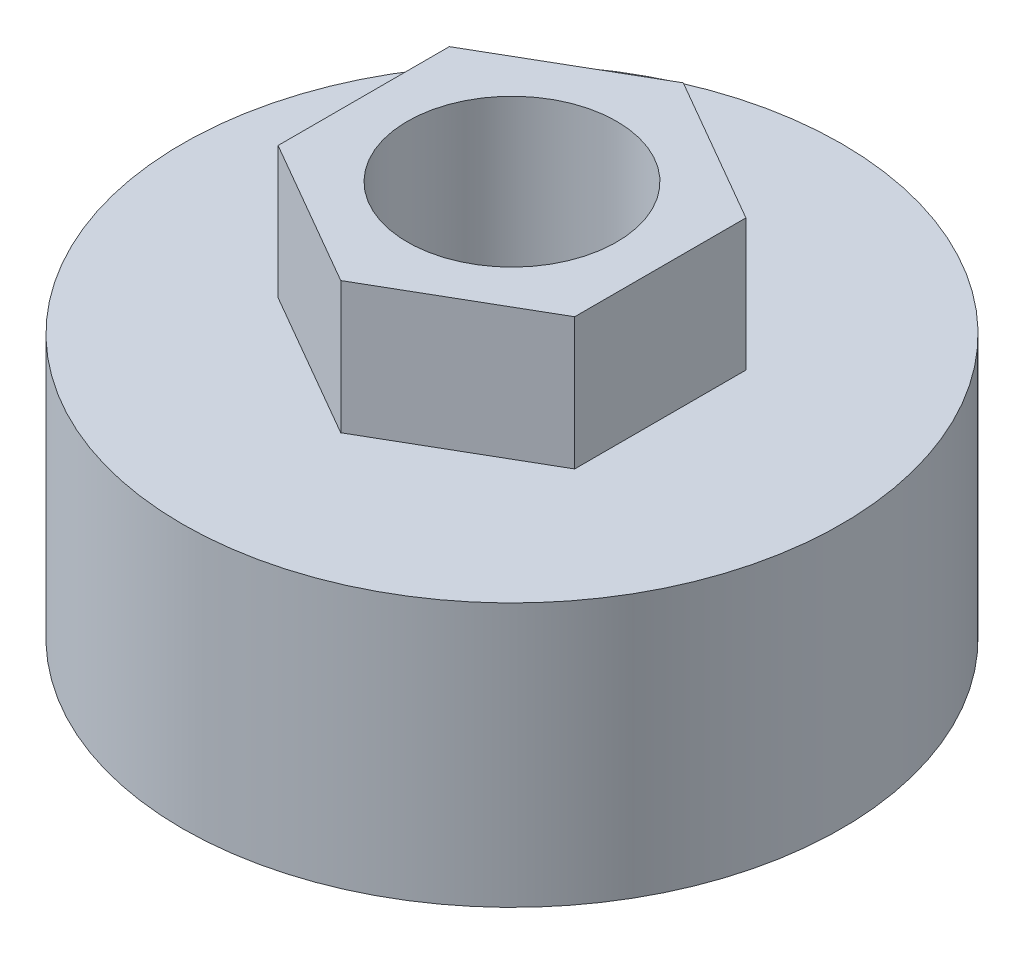
ISO-10303-21;
HEADER;
FILE_DESCRIPTION(('STEP AP214'),'2;1');
FILE_NAME('part.step','',(''),(''),'','','');
FILE_SCHEMA(('AUTOMOTIVE_DESIGN { 1 0 10303 214 1 1 1 1 }'));
ENDSEC;
DATA;
#1=APPLICATION_CONTEXT('core data for automotive mechanical design processes');
#2=APPLICATION_PROTOCOL_DEFINITION('international standard','automotive_design',2000,#1);
#3=PRODUCT_CONTEXT('',#1,'mechanical');
#4=PRODUCT('Part','Part','',(#3));
#5=PRODUCT_RELATED_PRODUCT_CATEGORY('part','',(#4));
#6=PRODUCT_DEFINITION_FORMATION('','',#4);
#7=PRODUCT_DEFINITION_CONTEXT('part definition',#1,'design');
#8=PRODUCT_DEFINITION('design','',#6,#7);
#9=PRODUCT_DEFINITION_SHAPE('','',#8);
#10=(LENGTH_UNIT() NAMED_UNIT(*) SI_UNIT(.MILLI.,.METRE.));
#11=(NAMED_UNIT(*) PLANE_ANGLE_UNIT() SI_UNIT($,.RADIAN.));
#12=(NAMED_UNIT(*) SI_UNIT($,.STERADIAN.) SOLID_ANGLE_UNIT());
#13=UNCERTAINTY_MEASURE_WITH_UNIT(LENGTH_MEASURE(1.E-05),#10,'distance_accuracy_value','');
#14=(GEOMETRIC_REPRESENTATION_CONTEXT(3) GLOBAL_UNCERTAINTY_ASSIGNED_CONTEXT((#13)) GLOBAL_UNIT_ASSIGNED_CONTEXT((#10,
#11,#12)) REPRESENTATION_CONTEXT('',''));
#15=CARTESIAN_POINT('',(0.,0.,0.));
#16=DIRECTION('',(0.,0.,1.));
#17=DIRECTION('',(1.,0.,0.));
#18=AXIS2_PLACEMENT_3D('',#15,#16,#17);
#19=CARTESIAN_POINT('',(5.0419,12.7,0.));
#20=DIRECTION('',(0.,1.,0.));
#21=DIRECTION('',(0.,0.,1.));
#22=AXIS2_PLACEMENT_3D('',#19,#20,#21);
#23=PLANE('',#22);
#24=CARTESIAN_POINT('',(0.,12.7,0.));
#25=DIRECTION('',(0.,-1.,0.));
#26=DIRECTION('',(0.,0.,-1.));
#27=AXIS2_PLACEMENT_3D('',#24,#25,#26);
#28=CIRCLE('',#27,15.875);
#29=CARTESIAN_POINT('',(0.,12.7,-15.875));
#30=VERTEX_POINT('',#29);
#31=EDGE_CURVE('E44',#30,#30,#28,.T.);
#32=ORIENTED_EDGE('',*,*,#31,.F.);
#33=EDGE_LOOP('',(#32));
#34=FACE_BOUND('',#33,.T.);
#35=DIRECTION('',(-0.866025403784439,0.,0.5));
#36=VECTOR('',#35,1.);
#37=CARTESIAN_POINT('',(0.,12.7,-8.24889197104678));
#38=LINE('',#37,#36);
#39=CARTESIAN_POINT('',(0.,12.7,-8.24889197104678));
#40=VERTEX_POINT('',#39);
#41=CARTESIAN_POINT('',(-7.14375,12.7,-4.12444598552339));
#42=VERTEX_POINT('',#41);
#43=EDGE_CURVE('E293',#40,#42,#38,.T.);
#44=ORIENTED_EDGE('',*,*,#43,.F.);
#45=DIRECTION('',(-0.866025403784439,0.,-0.5));
#46=VECTOR('',#45,1.);
#47=CARTESIAN_POINT('',(7.14375,12.7,-4.12444598552339));
#48=LINE('',#47,#46);
#49=CARTESIAN_POINT('',(7.14375,12.7,-4.12444598552339));
#50=VERTEX_POINT('',#49);
#51=EDGE_CURVE('E148',#50,#40,#48,.T.);
#52=ORIENTED_EDGE('',*,*,#51,.F.);
#53=DIRECTION('',(0.,0.,-1.));
#54=VECTOR('',#53,1.);
#55=CARTESIAN_POINT('',(7.14375,12.7,4.12444598552339));
#56=LINE('',#55,#54);
#57=CARTESIAN_POINT('',(7.14375,12.7,4.12444598552339));
#58=VERTEX_POINT('',#57);
#59=EDGE_CURVE('E144',#58,#50,#56,.T.);
#60=ORIENTED_EDGE('',*,*,#59,.F.);
#61=DIRECTION('',(0.866025403784439,0.,-0.5));
#62=VECTOR('',#61,1.);
#63=CARTESIAN_POINT('',(0.,12.7,8.24889197104678));
#64=LINE('',#63,#62);
#65=CARTESIAN_POINT('',(0.,12.7,8.24889197104678));
#66=VERTEX_POINT('',#65);
#67=EDGE_CURVE('E308',#66,#58,#64,.T.);
#68=ORIENTED_EDGE('',*,*,#67,.F.);
#69=DIRECTION('',(0.866025403784439,0.,0.5));
#70=VECTOR('',#69,1.);
#71=CARTESIAN_POINT('',(-7.14375,12.7,4.12444598552339));
#72=LINE('',#71,#70);
#73=CARTESIAN_POINT('',(-7.14375,12.7,4.12444598552339));
#74=VERTEX_POINT('',#73);
#75=EDGE_CURVE('E306',#74,#66,#72,.T.);
#76=ORIENTED_EDGE('',*,*,#75,.F.);
#77=DIRECTION('',(0.,0.,1.));
#78=VECTOR('',#77,1.);
#79=CARTESIAN_POINT('',(-7.14375,12.7,-4.12444598552339));
#80=LINE('',#79,#78);
#81=EDGE_CURVE('E304',#42,#74,#80,.T.);
#82=ORIENTED_EDGE('',*,*,#81,.F.);
#83=EDGE_LOOP('',(#44,#52,#60,#68,#76,#82));
#84=FACE_BOUND('',#83,.T.);
#85=ADVANCED_FACE('F35',(#34,#84),#23,.T.);
#86=CARTESIAN_POINT('',(0.,0.,0.));
#87=DIRECTION('',(0.,-1.,0.));
#88=DIRECTION('',(0.,0.,-1.));
#89=AXIS2_PLACEMENT_3D('',#86,#87,#88);
#90=CYLINDRICAL_SURFACE('',#89,5.0419);
#91=CARTESIAN_POINT('',(0.,9.525,0.));
#92=DIRECTION('',(0.,-1.,0.));
#93=DIRECTION('',(0.,0.,-1.));
#94=AXIS2_PLACEMENT_3D('',#91,#92,#93);
#95=CIRCLE('',#94,5.0419);
#96=CARTESIAN_POINT('',(0.,9.525,-5.0419));
#97=VERTEX_POINT('',#96);
#98=EDGE_CURVE('E39',#97,#97,#95,.T.);
#99=ORIENTED_EDGE('',*,*,#98,.T.);
#100=EDGE_LOOP('',(#99));
#101=FACE_BOUND('',#100,.T.);
#102=CARTESIAN_POINT('',(0.,19.05,0.));
#103=DIRECTION('',(0.,-1.,0.));
#104=DIRECTION('',(0.,0.,-1.));
#105=AXIS2_PLACEMENT_3D('',#102,#103,#104);
#106=CIRCLE('',#105,5.0419);
#107=CARTESIAN_POINT('',(0.,19.05,-5.0419));
#108=VERTEX_POINT('',#107);
#109=EDGE_CURVE('E291',#108,#108,#106,.T.);
#110=ORIENTED_EDGE('',*,*,#109,.F.);
#111=EDGE_LOOP('',(#110));
#112=FACE_BOUND('',#111,.T.);
#113=ADVANCED_FACE('F207',(#101,#112),#90,.F.);
#114=CARTESIAN_POINT('',(5.0419,0.,0.));
#115=DIRECTION('',(0.,-1.,0.));
#116=DIRECTION('',(0.,0.,-1.));
#117=AXIS2_PLACEMENT_3D('',#114,#115,#116);
#118=PLANE('',#117);
#119=DIRECTION('',(0.866025403784439,0.,0.5));
#120=VECTOR('',#119,1.);
#121=CARTESIAN_POINT('',(0.,0.,-8.79881810244989));
#122=LINE('',#121,#120);
#123=CARTESIAN_POINT('',(0.,0.,-8.79881810244989));
#124=VERTEX_POINT('',#123);
#125=CARTESIAN_POINT('',(7.62,0.,-4.39940905122495));
#126=VERTEX_POINT('',#125);
#127=EDGE_CURVE('E59',#124,#126,#122,.T.);
#128=ORIENTED_EDGE('',*,*,#127,.F.);
#129=DIRECTION('',(0.866025403784439,0.,-0.5));
#130=VECTOR('',#129,1.);
#131=CARTESIAN_POINT('',(-7.62,0.,-4.39940905122495));
#132=LINE('',#131,#130);
#133=CARTESIAN_POINT('',(-7.62,0.,-4.39940905122495));
#134=VERTEX_POINT('',#133);
#135=EDGE_CURVE('E161',#134,#124,#132,.T.);
#136=ORIENTED_EDGE('',*,*,#135,.F.);
#137=DIRECTION('',(0.,0.,-1.));
#138=VECTOR('',#137,1.);
#139=CARTESIAN_POINT('',(-7.62,0.,4.39940905122495));
#140=LINE('',#139,#138);
#141=CARTESIAN_POINT('',(-7.62,0.,4.39940905122495));
#142=VERTEX_POINT('',#141);
#143=EDGE_CURVE('E185',#142,#134,#140,.T.);
#144=ORIENTED_EDGE('',*,*,#143,.F.);
#145=DIRECTION('',(-0.866025403784439,0.,-0.5));
#146=VECTOR('',#145,1.);
#147=CARTESIAN_POINT('',(0.,0.,8.79881810244989));
#148=LINE('',#147,#146);
#149=CARTESIAN_POINT('',(0.,0.,8.79881810244989));
#150=VERTEX_POINT('',#149);
#151=EDGE_CURVE('E182',#150,#142,#148,.T.);
#152=ORIENTED_EDGE('',*,*,#151,.F.);
#153=DIRECTION('',(-0.866025403784439,0.,0.5));
#154=VECTOR('',#153,1.);
#155=CARTESIAN_POINT('',(7.62,0.,4.39940905122495));
#156=LINE('',#155,#154);
#157=CARTESIAN_POINT('',(7.62,0.,4.39940905122495));
#158=VERTEX_POINT('',#157);
#159=EDGE_CURVE('E179',#158,#150,#156,.T.);
#160=ORIENTED_EDGE('',*,*,#159,.F.);
#161=DIRECTION('',(0.,0.,1.));
#162=VECTOR('',#161,1.);
#163=CARTESIAN_POINT('',(7.62,0.,-4.39940905122495));
#164=LINE('',#163,#162);
#165=EDGE_CURVE('E151',#126,#158,#164,.T.);
#166=ORIENTED_EDGE('',*,*,#165,.F.);
#167=EDGE_LOOP('',(#128,#136,#144,#152,#160,#166));
#168=FACE_BOUND('',#167,.T.);
#169=CARTESIAN_POINT('',(0.,0.,0.));
#170=DIRECTION('',(0.,-1.,0.));
#171=DIRECTION('',(0.,0.,-1.));
#172=AXIS2_PLACEMENT_3D('',#169,#170,#171);
#173=CIRCLE('',#172,15.875);
#174=CARTESIAN_POINT('',(0.,0.,-15.875));
#175=VERTEX_POINT('',#174);
#176=EDGE_CURVE('E11',#175,#175,#173,.T.);
#177=ORIENTED_EDGE('',*,*,#176,.T.);
#178=EDGE_LOOP('',(#177));
#179=FACE_BOUND('',#178,.T.);
#180=ADVANCED_FACE('F37',(#168,#179),#118,.T.);
#181=CARTESIAN_POINT('',(0.,0.,0.));
#182=DIRECTION('',(0.,-1.,0.));
#183=DIRECTION('',(0.,0.,-1.));
#184=AXIS2_PLACEMENT_3D('',#181,#182,#183);
#185=CYLINDRICAL_SURFACE('',#184,15.875);
#186=ORIENTED_EDGE('',*,*,#31,.T.);
#187=EDGE_LOOP('',(#186));
#188=FACE_BOUND('',#187,.T.);
#189=ORIENTED_EDGE('',*,*,#176,.F.);
#190=EDGE_LOOP('',(#189));
#191=FACE_BOUND('',#190,.T.);
#192=ADVANCED_FACE('F239',(#188,#191),#185,.T.);
#193=CARTESIAN_POINT('',(0.,9.525,-8.79881810244989));
#194=DIRECTION('',(0.5,0.,-0.866025403784439));
#195=DIRECTION('',(-0.866025403784439,0.,-0.5));
#196=AXIS2_PLACEMENT_3D('',#193,#194,#195);
#197=PLANE('',#196);
#198=ORIENTED_EDGE('',*,*,#127,.T.);
#199=DIRECTION('',(0.,-1.,0.));
#200=VECTOR('',#199,1.);
#201=CARTESIAN_POINT('',(7.62,9.525,-4.39940905122495));
#202=LINE('',#201,#200);
#203=CARTESIAN_POINT('',(7.62,9.525,-4.39940905122495));
#204=VERTEX_POINT('',#203);
#205=EDGE_CURVE('E175',#204,#126,#202,.T.);
#206=ORIENTED_EDGE('',*,*,#205,.F.);
#207=DIRECTION('',(0.866025403784439,0.,0.5));
#208=VECTOR('',#207,1.);
#209=CARTESIAN_POINT('',(0.,9.525,-8.79881810244989));
#210=LINE('',#209,#208);
#211=CARTESIAN_POINT('',(0.,9.525,-8.79881810244989));
#212=VERTEX_POINT('',#211);
#213=EDGE_CURVE('E157',#212,#204,#210,.T.);
#214=ORIENTED_EDGE('',*,*,#213,.F.);
#215=DIRECTION('',(0.,-1.,0.));
#216=VECTOR('',#215,1.);
#217=CARTESIAN_POINT('',(0.,9.525,-8.79881810244989));
#218=LINE('',#217,#216);
#219=EDGE_CURVE('E190',#212,#124,#218,.T.);
#220=ORIENTED_EDGE('',*,*,#219,.T.);
#221=EDGE_LOOP('',(#198,#206,#214,#220));
#222=FACE_BOUND('',#221,.T.);
#223=ADVANCED_FACE('F218',(#222),#197,.F.);
#224=CARTESIAN_POINT('',(-7.62,9.525,-4.39940905122495));
#225=DIRECTION('',(-0.5,0.,-0.866025403784439));
#226=DIRECTION('',(-0.866025403784438,0.,0.5));
#227=AXIS2_PLACEMENT_3D('',#224,#225,#226);
#228=PLANE('',#227);
#229=ORIENTED_EDGE('',*,*,#135,.T.);
#230=ORIENTED_EDGE('',*,*,#219,.F.);
#231=DIRECTION('',(0.866025403784439,0.,-0.5));
#232=VECTOR('',#231,1.);
#233=CARTESIAN_POINT('',(-7.62,9.525,-4.39940905122495));
#234=LINE('',#233,#232);
#235=CARTESIAN_POINT('',(-7.62,9.525,-4.39940905122495));
#236=VERTEX_POINT('',#235);
#237=EDGE_CURVE('E173',#236,#212,#234,.T.);
#238=ORIENTED_EDGE('',*,*,#237,.F.);
#239=DIRECTION('',(0.,-1.,0.));
#240=VECTOR('',#239,1.);
#241=CARTESIAN_POINT('',(-7.62,9.525,-4.39940905122495));
#242=LINE('',#241,#240);
#243=EDGE_CURVE('E192',#236,#134,#242,.T.);
#244=ORIENTED_EDGE('',*,*,#243,.T.);
#245=EDGE_LOOP('',(#229,#230,#238,#244));
#246=FACE_BOUND('',#245,.T.);
#247=ADVANCED_FACE('F235',(#246),#228,.F.);
#248=CARTESIAN_POINT('',(-7.62,9.525,4.39940905122495));
#249=DIRECTION('',(-1.,0.,0.));
#250=DIRECTION('',(0.,0.,1.));
#251=AXIS2_PLACEMENT_3D('',#248,#249,#250);
#252=PLANE('',#251);
#253=ORIENTED_EDGE('',*,*,#143,.T.);
#254=ORIENTED_EDGE('',*,*,#243,.F.);
#255=DIRECTION('',(0.,0.,-1.));
#256=VECTOR('',#255,1.);
#257=CARTESIAN_POINT('',(-7.62,9.525,4.39940905122495));
#258=LINE('',#257,#256);
#259=CARTESIAN_POINT('',(-7.62,9.525,4.39940905122495));
#260=VERTEX_POINT('',#259);
#261=EDGE_CURVE('E170',#260,#236,#258,.T.);
#262=ORIENTED_EDGE('',*,*,#261,.F.);
#263=DIRECTION('',(0.,-1.,0.));
#264=VECTOR('',#263,1.);
#265=CARTESIAN_POINT('',(-7.62,9.525,4.39940905122495));
#266=LINE('',#265,#264);
#267=EDGE_CURVE('E194',#260,#142,#266,.T.);
#268=ORIENTED_EDGE('',*,*,#267,.T.);
#269=EDGE_LOOP('',(#253,#254,#262,#268));
#270=FACE_BOUND('',#269,.T.);
#271=ADVANCED_FACE('F232',(#270),#252,.F.);
#272=CARTESIAN_POINT('',(0.,9.525,8.79881810244989));
#273=DIRECTION('',(-0.5,0.,0.866025403784439));
#274=DIRECTION('',(0.866025403784439,0.,0.5));
#275=AXIS2_PLACEMENT_3D('',#272,#273,#274);
#276=PLANE('',#275);
#277=ORIENTED_EDGE('',*,*,#151,.T.);
#278=ORIENTED_EDGE('',*,*,#267,.F.);
#279=DIRECTION('',(-0.866025403784439,0.,-0.5));
#280=VECTOR('',#279,1.);
#281=CARTESIAN_POINT('',(0.,9.525,8.79881810244989));
#282=LINE('',#281,#280);
#283=CARTESIAN_POINT('',(0.,9.525,8.79881810244989));
#284=VERTEX_POINT('',#283);
#285=EDGE_CURVE('E167',#284,#260,#282,.T.);
#286=ORIENTED_EDGE('',*,*,#285,.F.);
#287=DIRECTION('',(0.,-1.,0.));
#288=VECTOR('',#287,1.);
#289=CARTESIAN_POINT('',(0.,9.525,8.79881810244989));
#290=LINE('',#289,#288);
#291=EDGE_CURVE('E196',#284,#150,#290,.T.);
#292=ORIENTED_EDGE('',*,*,#291,.T.);
#293=EDGE_LOOP('',(#277,#278,#286,#292));
#294=FACE_BOUND('',#293,.T.);
#295=ADVANCED_FACE('F228',(#294),#276,.F.);
#296=CARTESIAN_POINT('',(7.62,9.525,4.39940905122495));
#297=DIRECTION('',(0.5,0.,0.866025403784439));
#298=DIRECTION('',(0.866025403784439,0.,-0.5));
#299=AXIS2_PLACEMENT_3D('',#296,#297,#298);
#300=PLANE('',#299);
#301=ORIENTED_EDGE('',*,*,#159,.T.);
#302=ORIENTED_EDGE('',*,*,#291,.F.);
#303=DIRECTION('',(-0.866025403784439,0.,0.5));
#304=VECTOR('',#303,1.);
#305=CARTESIAN_POINT('',(7.62,9.525,4.39940905122495));
#306=LINE('',#305,#304);
#307=CARTESIAN_POINT('',(7.62,9.525,4.39940905122495));
#308=VERTEX_POINT('',#307);
#309=EDGE_CURVE('E164',#308,#284,#306,.T.);
#310=ORIENTED_EDGE('',*,*,#309,.F.);
#311=DIRECTION('',(0.,-1.,0.));
#312=VECTOR('',#311,1.);
#313=CARTESIAN_POINT('',(7.62,9.525,4.39940905122495));
#314=LINE('',#313,#312);
#315=EDGE_CURVE('E198',#308,#158,#314,.T.);
#316=ORIENTED_EDGE('',*,*,#315,.T.);
#317=EDGE_LOOP('',(#301,#302,#310,#316));
#318=FACE_BOUND('',#317,.T.);
#319=ADVANCED_FACE('F224',(#318),#300,.F.);
#320=CARTESIAN_POINT('',(7.62,9.525,-4.39940905122495));
#321=DIRECTION('',(1.,0.,0.));
#322=DIRECTION('',(0.,0.,-1.));
#323=AXIS2_PLACEMENT_3D('',#320,#321,#322);
#324=PLANE('',#323);
#325=ORIENTED_EDGE('',*,*,#165,.T.);
#326=ORIENTED_EDGE('',*,*,#315,.F.);
#327=DIRECTION('',(0.,0.,1.));
#328=VECTOR('',#327,1.);
#329=CARTESIAN_POINT('',(7.62,9.525,-4.39940905122495));
#330=LINE('',#329,#328);
#331=EDGE_CURVE('E160',#204,#308,#330,.T.);
#332=ORIENTED_EDGE('',*,*,#331,.F.);
#333=ORIENTED_EDGE('',*,*,#205,.T.);
#334=EDGE_LOOP('',(#325,#326,#332,#333));
#335=FACE_BOUND('',#334,.T.);
#336=ADVANCED_FACE('F213',(#335),#324,.F.);
#337=CARTESIAN_POINT('',(0.,9.525,0.));
#338=DIRECTION('',(0.,-1.,0.));
#339=DIRECTION('',(0.,0.,-1.));
#340=AXIS2_PLACEMENT_3D('',#337,#338,#339);
#341=PLANE('',#340);
#342=ORIENTED_EDGE('',*,*,#98,.F.);
#343=EDGE_LOOP('',(#342));
#344=FACE_BOUND('',#343,.T.);
#345=ORIENTED_EDGE('',*,*,#213,.T.);
#346=ORIENTED_EDGE('',*,*,#331,.T.);
#347=ORIENTED_EDGE('',*,*,#309,.T.);
#348=ORIENTED_EDGE('',*,*,#285,.T.);
#349=ORIENTED_EDGE('',*,*,#261,.T.);
#350=ORIENTED_EDGE('',*,*,#237,.T.);
#351=EDGE_LOOP('',(#345,#346,#347,#348,#349,#350));
#352=FACE_BOUND('',#351,.T.);
#353=ADVANCED_FACE('F210',(#344,#352),#341,.T.);
#354=CARTESIAN_POINT('',(0.,19.05,0.));
#355=DIRECTION('',(0.,1.,0.));
#356=DIRECTION('',(0.,0.,1.));
#357=AXIS2_PLACEMENT_3D('',#354,#355,#356);
#358=PLANE('',#357);
#359=ORIENTED_EDGE('',*,*,#109,.T.);
#360=EDGE_LOOP('',(#359));
#361=FACE_BOUND('',#360,.T.);
#362=DIRECTION('',(-0.866025403784439,0.,-0.5));
#363=VECTOR('',#362,1.);
#364=CARTESIAN_POINT('',(7.14375,19.05,-4.12444598552339));
#365=LINE('',#364,#363);
#366=CARTESIAN_POINT('',(7.14375,19.05,-4.12444598552339));
#367=VERTEX_POINT('',#366);
#368=CARTESIAN_POINT('',(0.,19.05,-8.24889197104678));
#369=VERTEX_POINT('',#368);
#370=EDGE_CURVE('E136',#367,#369,#365,.T.);
#371=ORIENTED_EDGE('',*,*,#370,.T.);
#372=DIRECTION('',(-0.866025403784439,0.,0.5));
#373=VECTOR('',#372,1.);
#374=CARTESIAN_POINT('',(0.,19.05,-8.24889197104678));
#375=LINE('',#374,#373);
#376=CARTESIAN_POINT('',(-7.14375,19.05,-4.12444598552339));
#377=VERTEX_POINT('',#376);
#378=EDGE_CURVE('E125',#369,#377,#375,.T.);
#379=ORIENTED_EDGE('',*,*,#378,.T.);
#380=DIRECTION('',(0.,0.,1.));
#381=VECTOR('',#380,1.);
#382=CARTESIAN_POINT('',(-7.14375,19.05,-4.12444598552339));
#383=LINE('',#382,#381);
#384=CARTESIAN_POINT('',(-7.14375,19.05,4.12444598552339));
#385=VERTEX_POINT('',#384);
#386=EDGE_CURVE('E135',#377,#385,#383,.T.);
#387=ORIENTED_EDGE('',*,*,#386,.T.);
#388=DIRECTION('',(0.866025403784439,0.,0.5));
#389=VECTOR('',#388,1.);
#390=CARTESIAN_POINT('',(-7.14375,19.05,4.12444598552339));
#391=LINE('',#390,#389);
#392=CARTESIAN_POINT('',(0.,19.05,8.24889197104678));
#393=VERTEX_POINT('',#392);
#394=EDGE_CURVE('E297',#385,#393,#391,.T.);
#395=ORIENTED_EDGE('',*,*,#394,.T.);
#396=DIRECTION('',(0.866025403784439,0.,-0.5));
#397=VECTOR('',#396,1.);
#398=CARTESIAN_POINT('',(0.,19.05,8.24889197104678));
#399=LINE('',#398,#397);
#400=CARTESIAN_POINT('',(7.14375,19.05,4.12444598552339));
#401=VERTEX_POINT('',#400);
#402=EDGE_CURVE('E299',#393,#401,#399,.T.);
#403=ORIENTED_EDGE('',*,*,#402,.T.);
#404=DIRECTION('',(0.,0.,-1.));
#405=VECTOR('',#404,1.);
#406=CARTESIAN_POINT('',(7.14375,19.05,4.12444598552339));
#407=LINE('',#406,#405);
#408=EDGE_CURVE('E140',#401,#367,#407,.T.);
#409=ORIENTED_EDGE('',*,*,#408,.T.);
#410=EDGE_LOOP('',(#371,#379,#387,#395,#403,#409));
#411=FACE_BOUND('',#410,.T.);
#412=ADVANCED_FACE('F139',(#361,#411),#358,.T.);
#413=CARTESIAN_POINT('',(7.14375,19.05,4.12444598552339));
#414=DIRECTION('',(-1.,0.,0.));
#415=DIRECTION('',(0.,0.,1.));
#416=AXIS2_PLACEMENT_3D('',#413,#414,#415);
#417=PLANE('',#416);
#418=ORIENTED_EDGE('',*,*,#59,.T.);
#419=DIRECTION('',(0.,-1.,0.));
#420=VECTOR('',#419,1.);
#421=CARTESIAN_POINT('',(7.14375,19.05,-4.12444598552339));
#422=LINE('',#421,#420);
#423=EDGE_CURVE('E301',#367,#50,#422,.T.);
#424=ORIENTED_EDGE('',*,*,#423,.F.);
#425=ORIENTED_EDGE('',*,*,#408,.F.);
#426=DIRECTION('',(0.,-1.,0.));
#427=VECTOR('',#426,1.);
#428=CARTESIAN_POINT('',(7.14375,19.05,4.12444598552339));
#429=LINE('',#428,#427);
#430=EDGE_CURVE('E51',#401,#58,#429,.T.);
#431=ORIENTED_EDGE('',*,*,#430,.T.);
#432=EDGE_LOOP('',(#418,#424,#425,#431));
#433=FACE_BOUND('',#432,.T.);
#434=ADVANCED_FACE('F281',(#433),#417,.F.);
#435=CARTESIAN_POINT('',(0.,19.05,8.24889197104678));
#436=DIRECTION('',(-0.5,0.,-0.866025403784439));
#437=DIRECTION('',(-0.866025403784439,0.,0.5));
#438=AXIS2_PLACEMENT_3D('',#435,#436,#437);
#439=PLANE('',#438);
#440=ORIENTED_EDGE('',*,*,#67,.T.);
#441=ORIENTED_EDGE('',*,*,#430,.F.);
#442=ORIENTED_EDGE('',*,*,#402,.F.);
#443=DIRECTION('',(0.,-1.,0.));
#444=VECTOR('',#443,1.);
#445=CARTESIAN_POINT('',(0.,19.05,8.24889197104678));
#446=LINE('',#445,#444);
#447=EDGE_CURVE('E313',#393,#66,#446,.T.);
#448=ORIENTED_EDGE('',*,*,#447,.T.);
#449=EDGE_LOOP('',(#440,#441,#442,#448));
#450=FACE_BOUND('',#449,.T.);
#451=ADVANCED_FACE('F277',(#450),#439,.F.);
#452=CARTESIAN_POINT('',(-7.14375,19.05,4.12444598552339));
#453=DIRECTION('',(0.5,0.,-0.866025403784439));
#454=DIRECTION('',(-0.866025403784439,0.,-0.5));
#455=AXIS2_PLACEMENT_3D('',#452,#453,#454);
#456=PLANE('',#455);
#457=ORIENTED_EDGE('',*,*,#75,.T.);
#458=ORIENTED_EDGE('',*,*,#447,.F.);
#459=ORIENTED_EDGE('',*,*,#394,.F.);
#460=DIRECTION('',(0.,-1.,0.));
#461=VECTOR('',#460,1.);
#462=CARTESIAN_POINT('',(-7.14375,19.05,4.12444598552339));
#463=LINE('',#462,#461);
#464=EDGE_CURVE('E153',#385,#74,#463,.T.);
#465=ORIENTED_EDGE('',*,*,#464,.T.);
#466=EDGE_LOOP('',(#457,#458,#459,#465));
#467=FACE_BOUND('',#466,.T.);
#468=ADVANCED_FACE('F273',(#467),#456,.F.);
#469=CARTESIAN_POINT('',(-7.14375,19.05,-4.12444598552339));
#470=DIRECTION('',(1.,0.,0.));
#471=DIRECTION('',(0.,0.,-1.));
#472=AXIS2_PLACEMENT_3D('',#469,#470,#471);
#473=PLANE('',#472);
#474=ORIENTED_EDGE('',*,*,#81,.T.);
#475=ORIENTED_EDGE('',*,*,#464,.F.);
#476=ORIENTED_EDGE('',*,*,#386,.F.);
#477=DIRECTION('',(0.,-1.,0.));
#478=VECTOR('',#477,1.);
#479=CARTESIAN_POINT('',(-7.14375,19.05,-4.12444598552339));
#480=LINE('',#479,#478);
#481=EDGE_CURVE('E132',#377,#42,#480,.T.);
#482=ORIENTED_EDGE('',*,*,#481,.T.);
#483=EDGE_LOOP('',(#474,#475,#476,#482));
#484=FACE_BOUND('',#483,.T.);
#485=ADVANCED_FACE('F270',(#484),#473,.F.);
#486=CARTESIAN_POINT('',(0.,19.05,-8.24889197104678));
#487=DIRECTION('',(0.5,0.,0.866025403784439));
#488=DIRECTION('',(0.866025403784439,0.,-0.5));
#489=AXIS2_PLACEMENT_3D('',#486,#487,#488);
#490=PLANE('',#489);
#491=ORIENTED_EDGE('',*,*,#43,.T.);
#492=ORIENTED_EDGE('',*,*,#481,.F.);
#493=ORIENTED_EDGE('',*,*,#378,.F.);
#494=DIRECTION('',(0.,-1.,0.));
#495=VECTOR('',#494,1.);
#496=CARTESIAN_POINT('',(0.,19.05,-8.24889197104678));
#497=LINE('',#496,#495);
#498=EDGE_CURVE('E129',#369,#40,#497,.T.);
#499=ORIENTED_EDGE('',*,*,#498,.T.);
#500=EDGE_LOOP('',(#491,#492,#493,#499));
#501=FACE_BOUND('',#500,.T.);
#502=ADVANCED_FACE('F127',(#501),#490,.F.);
#503=CARTESIAN_POINT('',(7.14375,19.05,-4.12444598552339));
#504=DIRECTION('',(-0.5,0.,0.866025403784439));
#505=DIRECTION('',(0.866025403784439,0.,0.5));
#506=AXIS2_PLACEMENT_3D('',#503,#504,#505);
#507=PLANE('',#506);
#508=ORIENTED_EDGE('',*,*,#51,.T.);
#509=ORIENTED_EDGE('',*,*,#498,.F.);
#510=ORIENTED_EDGE('',*,*,#370,.F.);
#511=ORIENTED_EDGE('',*,*,#423,.T.);
#512=EDGE_LOOP('',(#508,#509,#510,#511));
#513=FACE_BOUND('',#512,.T.);
#514=ADVANCED_FACE('F146',(#513),#507,.F.);
#515=CLOSED_SHELL('',(#85,#113,#180,#192,#223,#247,#271,#295,#319,#336,#353,#412,#434,#451,#468,
#485,#502,#514));
#516=MANIFOLD_SOLID_BREP('B2',#515);
#517=ADVANCED_BREP_SHAPE_REPRESENTATION('',(#18,#516),#14);
#518=SHAPE_DEFINITION_REPRESENTATION(#9,#517);
ENDSEC;
END-ISO-10303-21;
